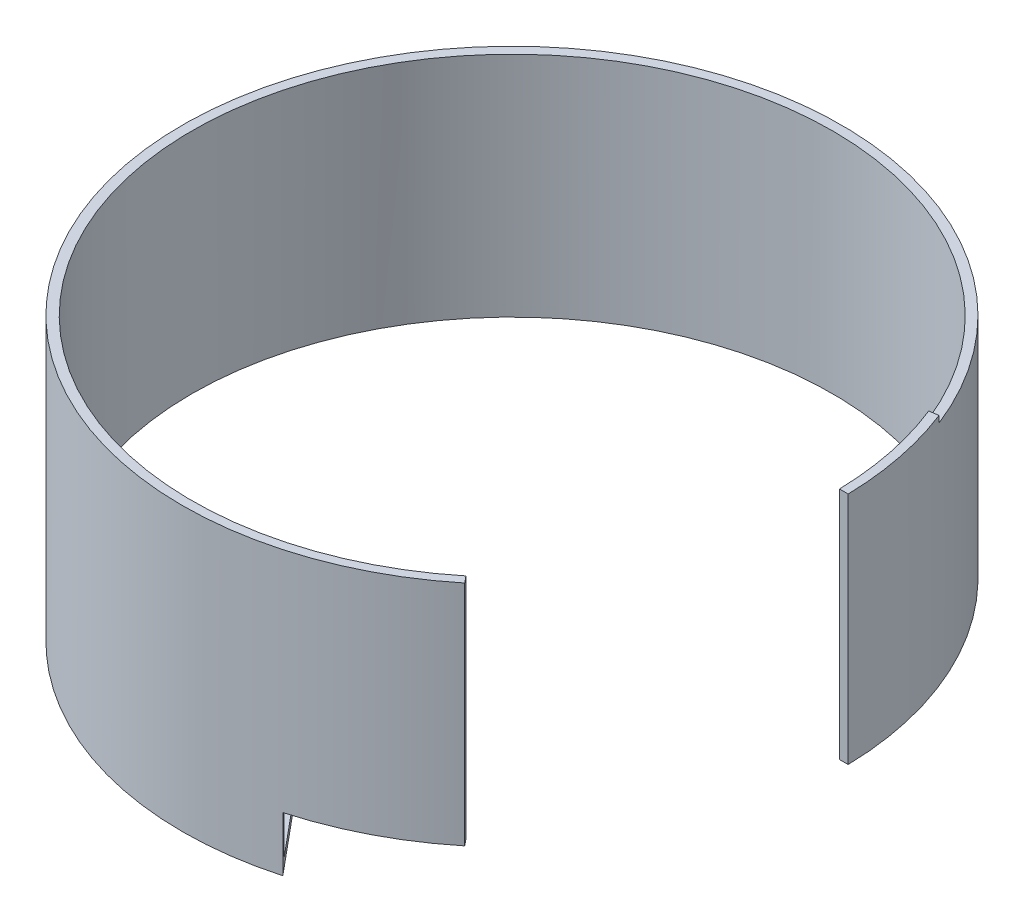
ISO-10303-21;
HEADER;
FILE_DESCRIPTION(('STEP AP214'),'2;1');
FILE_NAME('part.step','',(''),(''),'','','');
FILE_SCHEMA(('AUTOMOTIVE_DESIGN { 1 0 10303 214 1 1 1 1 }'));
ENDSEC;
DATA;
#1=APPLICATION_CONTEXT('core data for automotive mechanical design processes');
#2=APPLICATION_PROTOCOL_DEFINITION('international standard','automotive_design',2000,#1);
#3=PRODUCT_CONTEXT('',#1,'mechanical');
#4=PRODUCT('Part','Part','',(#3));
#5=PRODUCT_RELATED_PRODUCT_CATEGORY('part','',(#4));
#6=PRODUCT_DEFINITION_FORMATION('','',#4);
#7=PRODUCT_DEFINITION_CONTEXT('part definition',#1,'design');
#8=PRODUCT_DEFINITION('design','',#6,#7);
#9=PRODUCT_DEFINITION_SHAPE('','',#8);
#10=(LENGTH_UNIT() NAMED_UNIT(*) SI_UNIT(.MILLI.,.METRE.));
#11=(NAMED_UNIT(*) PLANE_ANGLE_UNIT() SI_UNIT($,.RADIAN.));
#12=(NAMED_UNIT(*) SI_UNIT($,.STERADIAN.) SOLID_ANGLE_UNIT());
#13=UNCERTAINTY_MEASURE_WITH_UNIT(LENGTH_MEASURE(1.E-05),#10,'distance_accuracy_value','');
#14=(GEOMETRIC_REPRESENTATION_CONTEXT(3) GLOBAL_UNCERTAINTY_ASSIGNED_CONTEXT((#13)) GLOBAL_UNIT_ASSIGNED_CONTEXT((#10,
#11,#12)) REPRESENTATION_CONTEXT('',''));
#15=CARTESIAN_POINT('',(0.,0.,0.));
#16=DIRECTION('',(0.,0.,1.));
#17=DIRECTION('',(1.,0.,0.));
#18=AXIS2_PLACEMENT_3D('',#15,#16,#17);
#19=CARTESIAN_POINT('',(0.,-98.298,0.));
#20=DIRECTION('',(0.,1.,0.));
#21=DIRECTION('',(0.,0.,1.));
#22=AXIS2_PLACEMENT_3D('',#19,#20,#21);
#23=CYLINDRICAL_SURFACE('',#22,116.674999949);
#24=DIRECTION('',(0.,-1.,0.));
#25=VECTOR('',#24,1.);
#26=CARTESIAN_POINT('',(29.7301940958419,-78.359,112.823628607321));
#27=LINE('',#26,#25);
#28=CARTESIAN_POINT('',(29.7301940958419,-78.359,112.823628607321));
#29=VERTEX_POINT('',#28);
#30=CARTESIAN_POINT('',(29.7301940958419,-95.123,112.823628607321));
#31=VERTEX_POINT('',#30);
#32=EDGE_CURVE('E297',#29,#31,#27,.T.);
#33=ORIENTED_EDGE('',*,*,#32,.T.);
#34=CARTESIAN_POINT('',(0.,-95.123,0.));
#35=DIRECTION('',(0.,-1.,0.));
#36=DIRECTION('',(0.,0.,-1.));
#37=AXIS2_PLACEMENT_3D('',#34,#35,#36);
#38=CIRCLE('',#37,116.674999949);
#39=CARTESIAN_POINT('',(-89.6891698800722,-95.123,74.6251192248475));
#40=VERTEX_POINT('',#39);
#41=EDGE_CURVE('E283',#31,#40,#38,.T.);
#42=ORIENTED_EDGE('',*,*,#41,.T.);
#43=DIRECTION('',(0.,-1.,0.));
#44=VECTOR('',#43,1.);
#45=CARTESIAN_POINT('',(-89.6891698800722,-78.359,74.6251192248475));
#46=LINE('',#45,#44);
#47=CARTESIAN_POINT('',(-89.6891698800722,-78.359,74.6251192248475));
#48=VERTEX_POINT('',#47);
#49=EDGE_CURVE('E313',#48,#40,#46,.T.);
#50=ORIENTED_EDGE('',*,*,#49,.F.);
#51=CARTESIAN_POINT('',(0.,-78.359,0.));
#52=DIRECTION('',(0.,-1.,0.));
#53=DIRECTION('',(0.,0.,-1.));
#54=AXIS2_PLACEMENT_3D('',#51,#52,#53);
#55=CIRCLE('',#54,116.674999949);
#56=CARTESIAN_POINT('',(116.647348933009,-78.359,-2.54));
#57=VERTEX_POINT('',#56);
#58=EDGE_CURVE('E175',#48,#57,#55,.T.);
#59=ORIENTED_EDGE('',*,*,#58,.T.);
#60=DIRECTION('',(0.,1.,0.));
#61=VECTOR('',#60,1.);
#62=CARTESIAN_POINT('',(116.647348933009,-98.298,-2.54));
#63=LINE('',#62,#61);
#64=CARTESIAN_POINT('',(116.647348933009,6.9835014,-2.53999999999999));
#65=VERTEX_POINT('',#64);
#66=EDGE_CURVE('E38',#57,#65,#63,.T.);
#67=ORIENTED_EDGE('',*,*,#66,.T.);
#68=CARTESIAN_POINT('',(2.78943534937071E-12,6.9835014,-5.62050406216485E-13));
#69=DIRECTION('',(0.,-1.,0.));
#70=DIRECTION('',(0.,0.,1.));
#71=AXIS2_PLACEMENT_3D('',#68,#69,#70);
#72=CIRCLE('',#71,116.674999948997);
#73=CARTESIAN_POINT('',(108.304935183754,6.9835014,-43.3946612838716));
#74=VERTEX_POINT('',#73);
#75=EDGE_CURVE('E173',#74,#65,#72,.T.);
#76=ORIENTED_EDGE('',*,*,#75,.F.);
#77=DIRECTION('',(0.,-1.,0.));
#78=VECTOR('',#77,1.);
#79=CARTESIAN_POINT('',(108.304935183754,6.9835014,-43.3946612838716));
#80=LINE('',#79,#78);
#81=CARTESIAN_POINT('',(108.304935183754,4.572,-43.3946612838716));
#82=VERTEX_POINT('',#81);
#83=EDGE_CURVE('E196',#74,#82,#80,.T.);
#84=ORIENTED_EDGE('',*,*,#83,.T.);
#85=CARTESIAN_POINT('',(0.,4.572,0.));
#86=DIRECTION('',(0.,1.,0.));
#87=DIRECTION('',(0.,0.,1.));
#88=AXIS2_PLACEMENT_3D('',#85,#86,#87);
#89=CIRCLE('',#88,116.674999949);
#90=CARTESIAN_POINT('',(73.6452892529888,4.572,90.4954528357241));
#91=VERTEX_POINT('',#90);
#92=EDGE_CURVE('E207',#82,#91,#89,.T.);
#93=ORIENTED_EDGE('',*,*,#92,.T.);
#94=DIRECTION('',(0.,1.,0.));
#95=VECTOR('',#94,1.);
#96=CARTESIAN_POINT('',(73.6452892529888,-98.298,90.4954528357241));
#97=LINE('',#96,#95);
#98=CARTESIAN_POINT('',(73.6452892529888,-78.359,90.4954528357241));
#99=VERTEX_POINT('',#98);
#100=EDGE_CURVE('E11',#99,#91,#97,.T.);
#101=ORIENTED_EDGE('',*,*,#100,.F.);
#102=CARTESIAN_POINT('',(2.0122792321331E-13,-78.359,3.33066907387547E-13));
#103=DIRECTION('',(0.,1.,0.));
#104=DIRECTION('',(0.,0.,1.));
#105=AXIS2_PLACEMENT_3D('',#102,#103,#104);
#106=CIRCLE('',#105,116.674999949);
#107=EDGE_CURVE('E323',#29,#99,#106,.T.);
#108=ORIENTED_EDGE('',*,*,#107,.F.);
#109=EDGE_LOOP('',(#33,#42,#50,#59,#67,#76,#84,#93,#101,#108));
#110=FACE_BOUND('',#109,.T.);
#111=ADVANCED_FACE('F35',(#110),#23,.F.);
#112=CARTESIAN_POINT('',(-0.184696627869449,-98.298,-0.08451396324239));
#113=DIRECTION('',(0.,1.,0.));
#114=DIRECTION('',(0.,0.,1.));
#115=AXIS2_PLACEMENT_3D('',#112,#113,#114);
#116=CYLINDRICAL_SURFACE('',#115,120.032164005851);
#117=CARTESIAN_POINT('',(-0.184696627869449,-78.359,-0.08451396324239));
#118=DIRECTION('',(0.,-1.,0.));
#119=DIRECTION('',(0.,0.,-1.));
#120=AXIS2_PLACEMENT_3D('',#117,#118,#119);
#121=CIRCLE('',#120,120.032164005851);
#122=CARTESIAN_POINT('',(-92.3373335218314,-78.359,76.8285012514602));
#123=VERTEX_POINT('',#122);
#124=CARTESIAN_POINT('',(119.822348933009,-78.359,-2.54000000000003));
#125=VERTEX_POINT('',#124);
#126=EDGE_CURVE('E305',#123,#125,#121,.T.);
#127=ORIENTED_EDGE('',*,*,#126,.F.);
#128=DIRECTION('',(0.,-1.,0.));
#129=VECTOR('',#128,1.);
#130=CARTESIAN_POINT('',(-92.3373335218314,-78.359,76.8285012514602));
#131=LINE('',#130,#129);
#132=CARTESIAN_POINT('',(-92.3373335218314,-98.298,76.8285012514602));
#133=VERTEX_POINT('',#132);
#134=EDGE_CURVE('E307',#123,#133,#131,.T.);
#135=ORIENTED_EDGE('',*,*,#134,.T.);
#136=CARTESIAN_POINT('',(-0.184696627869449,-98.298,-0.08451396324239));
#137=DIRECTION('',(0.,1.,0.));
#138=DIRECTION('',(0.,0.,1.));
#139=AXIS2_PLACEMENT_3D('',#136,#137,#138);
#140=CIRCLE('',#139,120.032164005851);
#141=CARTESIAN_POINT('',(32.0004356738825,-98.298,115.552148279518));
#142=VERTEX_POINT('',#141);
#143=EDGE_CURVE('E179',#133,#142,#140,.T.);
#144=ORIENTED_EDGE('',*,*,#143,.T.);
#145=DIRECTION('',(0.,-1.,0.));
#146=VECTOR('',#145,1.);
#147=CARTESIAN_POINT('',(32.0004356738826,-78.359,115.552148279518));
#148=LINE('',#147,#146);
#149=CARTESIAN_POINT('',(32.0004356738826,-78.359,115.552148279518));
#150=VERTEX_POINT('',#149);
#151=EDGE_CURVE('E59',#150,#142,#148,.T.);
#152=ORIENTED_EDGE('',*,*,#151,.F.);
#153=CARTESIAN_POINT('',(-0.184696627869425,-78.359,-0.0845139632423394));
#154=DIRECTION('',(0.,1.,0.));
#155=DIRECTION('',(0.,0.,1.));
#156=AXIS2_PLACEMENT_3D('',#153,#154,#155);
#157=CIRCLE('',#156,120.032164005851);
#158=CARTESIAN_POINT('',(75.6518916827654,-78.359,92.9559732954277));
#159=VERTEX_POINT('',#158);
#160=EDGE_CURVE('E320',#150,#159,#157,.T.);
#161=ORIENTED_EDGE('',*,*,#160,.T.);
#162=DIRECTION('',(0.,1.,0.));
#163=VECTOR('',#162,1.);
#164=CARTESIAN_POINT('',(75.6518916827654,-98.298,92.9559732954276));
#165=LINE('',#164,#163);
#166=CARTESIAN_POINT('',(75.6518916827654,4.572,92.9559732954276));
#167=VERTEX_POINT('',#166);
#168=EDGE_CURVE('E43',#159,#167,#165,.T.);
#169=ORIENTED_EDGE('',*,*,#168,.T.);
#170=CARTESIAN_POINT('',(-0.184696627869449,4.572,-0.08451396324239));
#171=DIRECTION('',(0.,1.,0.));
#172=DIRECTION('',(0.,0.,1.));
#173=AXIS2_PLACEMENT_3D('',#170,#171,#172);
#174=CIRCLE('',#173,120.032164005851);
#175=CARTESIAN_POINT('',(111.569940957261,4.572,-43.8865843953988));
#176=VERTEX_POINT('',#175);
#177=EDGE_CURVE('E202',#176,#167,#174,.T.);
#178=ORIENTED_EDGE('',*,*,#177,.F.);
#179=DIRECTION('',(0.,-1.,0.));
#180=VECTOR('',#179,1.);
#181=CARTESIAN_POINT('',(111.569940957261,6.9835014,-43.8865843953988));
#182=LINE('',#181,#180);
#183=CARTESIAN_POINT('',(111.569940957261,6.9835014,-43.8865843953988));
#184=VERTEX_POINT('',#183);
#185=EDGE_CURVE('E199',#184,#176,#182,.T.);
#186=ORIENTED_EDGE('',*,*,#185,.F.);
#187=CARTESIAN_POINT('',(-0.1846966278745,6.9835014,-0.0845139632413942));
#188=DIRECTION('',(0.,1.,0.));
#189=DIRECTION('',(0.,0.,1.));
#190=AXIS2_PLACEMENT_3D('',#187,#188,#189);
#191=CIRCLE('',#190,120.032164005856);
#192=CARTESIAN_POINT('',(119.822348933009,6.9835014,-2.53999999999999));
#193=VERTEX_POINT('',#192);
#194=EDGE_CURVE('E186',#193,#184,#191,.T.);
#195=ORIENTED_EDGE('',*,*,#194,.F.);
#196=DIRECTION('',(0.,1.,0.));
#197=VECTOR('',#196,1.);
#198=CARTESIAN_POINT('',(119.822348933009,-98.298,-2.54));
#199=LINE('',#198,#197);
#200=EDGE_CURVE('E178',#125,#193,#199,.T.);
#201=ORIENTED_EDGE('',*,*,#200,.F.);
#202=EDGE_LOOP('',(#127,#135,#144,#152,#161,#169,#178,#186,#195,#201));
#203=FACE_BOUND('',#202,.T.);
#204=ADVANCED_FACE('F336',(#203),#116,.T.);
#205=CARTESIAN_POINT('',(116.647348933009,-98.298,-2.54));
#206=DIRECTION('',(0.,0.,1.));
#207=DIRECTION('',(1.,0.,0.));
#208=AXIS2_PLACEMENT_3D('',#205,#206,#207);
#209=PLANE('',#208);
#210=ORIENTED_EDGE('',*,*,#66,.F.);
#211=DIRECTION('',(1.,0.,0.));
#212=VECTOR('',#211,1.);
#213=CARTESIAN_POINT('',(116.647348933009,-78.359,-2.54));
#214=LINE('',#213,#212);
#215=EDGE_CURVE('E303',#57,#125,#214,.T.);
#216=ORIENTED_EDGE('',*,*,#215,.T.);
#217=ORIENTED_EDGE('',*,*,#200,.T.);
#218=DIRECTION('',(1.,0.,0.));
#219=VECTOR('',#218,1.);
#220=CARTESIAN_POINT('',(116.647348933009,6.9835014,-2.53999999999999));
#221=LINE('',#220,#219);
#222=EDGE_CURVE('E181',#65,#193,#221,.T.);
#223=ORIENTED_EDGE('',*,*,#222,.F.);
#224=EDGE_LOOP('',(#210,#216,#217,#223));
#225=FACE_BOUND('',#224,.T.);
#226=ADVANCED_FACE('F182',(#225),#209,.T.);
#227=CARTESIAN_POINT('',(0.,-98.298,0.));
#228=DIRECTION('',(0.,1.,0.));
#229=DIRECTION('',(0.,0.,1.));
#230=AXIS2_PLACEMENT_3D('',#227,#228,#229);
#231=PLANE('',#230);
#232=DIRECTION('',(0.768709441738251,0.,-0.639598150546471));
#233=VECTOR('',#232,1.);
#234=CARTESIAN_POINT('',(-92.3373335218314,-98.298,76.8285012514601));
#235=LINE('',#234,#233);
#236=CARTESIAN_POINT('',(-37.9034466150368,-98.298,31.5372487934262));
#237=VERTEX_POINT('',#236);
#238=EDGE_CURVE('E301',#133,#237,#235,.T.);
#239=ORIENTED_EDGE('',*,*,#238,.T.);
#240=DIRECTION('',(-0.63959815054647,0.,-0.768709441738252));
#241=VECTOR('',#240,1.);
#242=CARTESIAN_POINT('',(32.0004356738826,-98.298,115.552148279518));
#243=LINE('',#242,#241);
#244=EDGE_CURVE('E310',#142,#237,#243,.T.);
#245=ORIENTED_EDGE('',*,*,#244,.F.);
#246=ORIENTED_EDGE('',*,*,#143,.F.);
#247=EDGE_LOOP('',(#239,#245,#246));
#248=FACE_BOUND('',#247,.T.);
#249=CARTESIAN_POINT('',(-66.1804562405467,-98.298,73.4133647851566));
#250=DIRECTION('',(0.,-1.,0.));
#251=DIRECTION('',(0.,0.,-1.));
#252=AXIS2_PLACEMENT_3D('',#249,#250,#251);
#253=CIRCLE('',#252,6.35);
#254=CARTESIAN_POINT('',(-71.0243507529685,-98.298,77.5193586907208));
#255=VERTEX_POINT('',#254);
#256=CARTESIAN_POINT('',(-61.3365617281249,-98.298,69.3073708795925));
#257=VERTEX_POINT('',#256);
#258=EDGE_CURVE('E209',#255,#257,#253,.T.);
#259=ORIENTED_EDGE('',*,*,#258,.F.);
#260=DIRECTION('',(-0.646613213474671,0.,-0.762818033452251));
#261=VECTOR('',#260,1.);
#262=CARTESIAN_POINT('',(-71.0243507529685,-98.298,77.5193586907208));
#263=LINE('',#262,#261);
#264=CARTESIAN_POINT('',(-51.2035880884852,-98.298,100.902170675025));
#265=VERTEX_POINT('',#264);
#266=EDGE_CURVE('E214',#265,#255,#263,.T.);
#267=ORIENTED_EDGE('',*,*,#266,.F.);
#268=CARTESIAN_POINT('',(-46.3596935760634,-98.298,96.7961767694608));
#269=DIRECTION('',(0.,-1.,0.));
#270=DIRECTION('',(0.,0.,1.));
#271=AXIS2_PLACEMENT_3D('',#268,#269,#270);
#272=CIRCLE('',#271,6.35);
#273=CARTESIAN_POINT('',(-41.5157990636416,-98.298,92.6901828638966));
#274=VERTEX_POINT('',#273);
#275=EDGE_CURVE('E228',#274,#265,#272,.T.);
#276=ORIENTED_EDGE('',*,*,#275,.F.);
#277=DIRECTION('',(0.646613213474671,0.,0.762818033452251));
#278=VECTOR('',#277,1.);
#279=CARTESIAN_POINT('',(-61.3365617281249,-98.298,69.3073708795925));
#280=LINE('',#279,#278);
#281=EDGE_CURVE('E225',#257,#274,#280,.T.);
#282=ORIENTED_EDGE('',*,*,#281,.F.);
#283=EDGE_LOOP('',(#259,#267,#276,#282));
#284=FACE_BOUND('',#283,.T.);
#285=CARTESIAN_POINT('',(-49.0690072513944,-98.298,56.93984279488));
#286=DIRECTION('',(0.,-1.,0.));
#287=DIRECTION('',(0.,0.,-1.));
#288=AXIS2_PLACEMENT_3D('',#285,#286,#287);
#289=CIRCLE('',#288,6.35000000000001);
#290=CARTESIAN_POINT('',(-53.9503122064323,-98.298,61.0012910508501));
#291=VERTEX_POINT('',#290);
#292=CARTESIAN_POINT('',(-44.1877022963565,-98.298,52.8783945389099));
#293=VERTEX_POINT('',#292);
#294=EDGE_CURVE('E235',#291,#293,#289,.T.);
#295=ORIENTED_EDGE('',*,*,#294,.F.);
#296=DIRECTION('',(-0.639598150546469,0.,-0.768709441738253));
#297=VECTOR('',#296,1.);
#298=CARTESIAN_POINT('',(-53.9503122064323,-98.298,61.0012910508501));
#299=LINE('',#298,#297);
#300=CARTESIAN_POINT('',(-21.5511486370197,-98.298,99.9406515210927));
#301=VERTEX_POINT('',#300);
#302=EDGE_CURVE('E246',#301,#291,#299,.T.);
#303=ORIENTED_EDGE('',*,*,#302,.F.);
#304=CARTESIAN_POINT('',(-16.6698436819818,-98.298,95.8792032651226));
#305=DIRECTION('',(0.,-1.,0.));
#306=DIRECTION('',(0.,0.,1.));
#307=AXIS2_PLACEMENT_3D('',#304,#305,#306);
#308=CIRCLE('',#307,6.35000000000001);
#309=CARTESIAN_POINT('',(-11.7885387269439,-98.298,91.8177550091525));
#310=VERTEX_POINT('',#309);
#311=EDGE_CURVE('E260',#310,#301,#308,.T.);
#312=ORIENTED_EDGE('',*,*,#311,.F.);
#313=DIRECTION('',(0.639598150546469,0.,0.768709441738253));
#314=VECTOR('',#313,1.);
#315=CARTESIAN_POINT('',(-44.1877022963565,-98.298,52.8783945389099));
#316=LINE('',#315,#314);
#317=EDGE_CURVE('E257',#293,#310,#316,.T.);
#318=ORIENTED_EDGE('',*,*,#317,.F.);
#319=EDGE_LOOP('',(#295,#303,#312,#318));
#320=FACE_BOUND('',#319,.T.);
#321=CARTESIAN_POINT('',(10.393383929728,-98.298,103.482781479031));
#322=DIRECTION('',(0.,-1.,0.));
#323=DIRECTION('',(0.,0.,-1.));
#324=AXIS2_PLACEMENT_3D('',#321,#322,#323);
#325=CIRCLE('',#324,3.50000000000001);
#326=CARTESIAN_POINT('',(10.393383929728,-98.298,99.9827814790306));
#327=VERTEX_POINT('',#326);
#328=EDGE_CURVE('E267',#327,#327,#325,.T.);
#329=ORIENTED_EDGE('',*,*,#328,.F.);
#330=EDGE_LOOP('',(#329));
#331=FACE_BOUND('',#330,.T.);
#332=CARTESIAN_POINT('',(-10.6211082019412,-98.298,78.2262379741027));
#333=DIRECTION('',(0.,-1.,0.));
#334=DIRECTION('',(0.,0.,-1.));
#335=AXIS2_PLACEMENT_3D('',#332,#333,#334);
#336=CIRCLE('',#335,3.50000000000001);
#337=CARTESIAN_POINT('',(-10.6211082019412,-98.298,74.7262379741027));
#338=VERTEX_POINT('',#337);
#339=EDGE_CURVE('E277',#338,#338,#336,.T.);
#340=ORIENTED_EDGE('',*,*,#339,.F.);
#341=EDGE_LOOP('',(#340));
#342=FACE_BOUND('',#341,.T.);
#343=ADVANCED_FACE('F357',(#248,#284,#320,#331,#342),#231,.F.);
#344=CARTESIAN_POINT('',(73.6452892529888,-98.298,90.4954528357241));
#345=DIRECTION('',(0.774967487374088,0.,-0.632001102461928));
#346=DIRECTION('',(-0.632001102461928,0.,-0.774967487374088));
#347=AXIS2_PLACEMENT_3D('',#344,#345,#346);
#348=PLANE('',#347);
#349=DIRECTION('',(0.632001102461916,0.,0.774967487374098));
#350=VECTOR('',#349,1.);
#351=CARTESIAN_POINT('',(73.6452892529888,-78.359,90.4954528357241));
#352=LINE('',#351,#350);
#353=EDGE_CURVE('E325',#99,#159,#352,.T.);
#354=ORIENTED_EDGE('',*,*,#353,.F.);
#355=ORIENTED_EDGE('',*,*,#100,.T.);
#356=DIRECTION('',(-0.632001102461935,0.,-0.774967487374082));
#357=VECTOR('',#356,1.);
#358=CARTESIAN_POINT('',(75.6518916827654,4.572,92.9559732954276));
#359=LINE('',#358,#357);
#360=EDGE_CURVE('E204',#167,#91,#359,.T.);
#361=ORIENTED_EDGE('',*,*,#360,.F.);
#362=ORIENTED_EDGE('',*,*,#168,.F.);
#363=EDGE_LOOP('',(#354,#355,#361,#362));
#364=FACE_BOUND('',#363,.T.);
#365=ADVANCED_FACE('F340',(#364),#348,.T.);
#366=CARTESIAN_POINT('',(32.0004356738826,-78.359,115.552148279518));
#367=DIRECTION('',(-0.768709441738252,0.,0.63959815054647));
#368=DIRECTION('',(0.63959815054647,0.,0.768709441738252));
#369=AXIS2_PLACEMENT_3D('',#366,#367,#368);
#370=PLANE('',#369);
#371=ORIENTED_EDGE('',*,*,#244,.T.);
#372=DIRECTION('',(0.,-1.,0.));
#373=VECTOR('',#372,1.);
#374=CARTESIAN_POINT('',(-37.9034466150368,-95.123,31.5372487934262));
#375=LINE('',#374,#373);
#376=CARTESIAN_POINT('',(-37.9034466150368,-95.123,31.5372487934262));
#377=VERTEX_POINT('',#376);
#378=EDGE_CURVE('E294',#377,#237,#375,.T.);
#379=ORIENTED_EDGE('',*,*,#378,.F.);
#380=DIRECTION('',(0.639598150546469,0.,0.768709441738252));
#381=VECTOR('',#380,1.);
#382=CARTESIAN_POINT('',(-37.9034466150368,-95.123,31.5372487934262));
#383=LINE('',#382,#381);
#384=EDGE_CURVE('E291',#377,#31,#383,.T.);
#385=ORIENTED_EDGE('',*,*,#384,.T.);
#386=ORIENTED_EDGE('',*,*,#32,.F.);
#387=DIRECTION('',(-0.63959815054647,0.,-0.768709441738252));
#388=VECTOR('',#387,1.);
#389=CARTESIAN_POINT('',(32.0004356738826,-78.359,115.552148279518));
#390=LINE('',#389,#388);
#391=EDGE_CURVE('E318',#150,#29,#390,.T.);
#392=ORIENTED_EDGE('',*,*,#391,.F.);
#393=ORIENTED_EDGE('',*,*,#151,.T.);
#394=EDGE_LOOP('',(#371,#379,#385,#386,#392,#393));
#395=FACE_BOUND('',#394,.T.);
#396=ADVANCED_FACE('F355',(#395),#370,.F.);
#397=CARTESIAN_POINT('',(-0.184696627869425,-78.359,-0.0845139632423394));
#398=DIRECTION('',(0.,1.,0.));
#399=DIRECTION('',(0.,0.,1.));
#400=AXIS2_PLACEMENT_3D('',#397,#398,#399);
#401=PLANE('',#400);
#402=ORIENTED_EDGE('',*,*,#160,.F.);
#403=ORIENTED_EDGE('',*,*,#391,.T.);
#404=ORIENTED_EDGE('',*,*,#107,.T.);
#405=ORIENTED_EDGE('',*,*,#353,.T.);
#406=EDGE_LOOP('',(#402,#403,#404,#405));
#407=FACE_BOUND('',#406,.T.);
#408=ADVANCED_FACE('F399',(#407),#401,.F.);
#409=CARTESIAN_POINT('',(-92.3373335218314,-78.359,76.8285012514601));
#410=DIRECTION('',(-0.639598150546471,0.,-0.768709441738251));
#411=DIRECTION('',(-0.768709441738251,0.,0.639598150546471));
#412=AXIS2_PLACEMENT_3D('',#409,#410,#411);
#413=PLANE('',#412);
#414=ORIENTED_EDGE('',*,*,#238,.F.);
#415=ORIENTED_EDGE('',*,*,#134,.F.);
#416=DIRECTION('',(0.768709441738251,0.,-0.639598150546471));
#417=VECTOR('',#416,1.);
#418=CARTESIAN_POINT('',(-92.3373335218314,-78.359,76.8285012514601));
#419=LINE('',#418,#417);
#420=EDGE_CURVE('E298',#123,#48,#419,.T.);
#421=ORIENTED_EDGE('',*,*,#420,.T.);
#422=ORIENTED_EDGE('',*,*,#49,.T.);
#423=DIRECTION('',(0.768709441738252,0.,-0.63959815054647));
#424=VECTOR('',#423,1.);
#425=CARTESIAN_POINT('',(-89.6891698800722,-95.123,74.6251192248475));
#426=LINE('',#425,#424);
#427=EDGE_CURVE('E288',#40,#377,#426,.T.);
#428=ORIENTED_EDGE('',*,*,#427,.T.);
#429=ORIENTED_EDGE('',*,*,#378,.T.);
#430=EDGE_LOOP('',(#414,#415,#421,#422,#428,#429));
#431=FACE_BOUND('',#430,.T.);
#432=ADVANCED_FACE('F350',(#431),#413,.T.);
#433=CARTESIAN_POINT('',(0.,-78.359,0.));
#434=DIRECTION('',(0.,-1.,0.));
#435=DIRECTION('',(0.,0.,-1.));
#436=AXIS2_PLACEMENT_3D('',#433,#434,#435);
#437=PLANE('',#436);
#438=ORIENTED_EDGE('',*,*,#420,.F.);
#439=ORIENTED_EDGE('',*,*,#126,.T.);
#440=ORIENTED_EDGE('',*,*,#215,.F.);
#441=ORIENTED_EDGE('',*,*,#58,.F.);
#442=EDGE_LOOP('',(#438,#439,#440,#441));
#443=FACE_BOUND('',#442,.T.);
#444=ADVANCED_FACE('F348',(#443),#437,.T.);
#445=CARTESIAN_POINT('',(0.,-95.123,0.));
#446=DIRECTION('',(0.,-1.,0.));
#447=DIRECTION('',(0.,0.,-1.));
#448=AXIS2_PLACEMENT_3D('',#445,#446,#447);
#449=PLANE('',#448);
#450=DIRECTION('',(-0.646613213474671,0.,-0.762818033452251));
#451=VECTOR('',#450,1.);
#452=CARTESIAN_POINT('',(-71.0243507529685,-95.123,77.5193586907208));
#453=LINE('',#452,#451);
#454=CARTESIAN_POINT('',(-51.2035880884852,-95.123,100.902170675025));
#455=VERTEX_POINT('',#454);
#456=CARTESIAN_POINT('',(-71.0243507529685,-95.123,77.5193586907208));
#457=VERTEX_POINT('',#456);
#458=EDGE_CURVE('E220',#455,#457,#453,.T.);
#459=ORIENTED_EDGE('',*,*,#458,.T.);
#460=CARTESIAN_POINT('',(-66.1804562405467,-95.123,73.4133647851566));
#461=DIRECTION('',(0.,-1.,0.));
#462=DIRECTION('',(0.,0.,-1.));
#463=AXIS2_PLACEMENT_3D('',#460,#461,#462);
#464=CIRCLE('',#463,6.35);
#465=CARTESIAN_POINT('',(-61.3365617281249,-95.123,69.3073708795925));
#466=VERTEX_POINT('',#465);
#467=EDGE_CURVE('E210',#457,#466,#464,.T.);
#468=ORIENTED_EDGE('',*,*,#467,.T.);
#469=DIRECTION('',(0.646613213474671,0.,0.762818033452251));
#470=VECTOR('',#469,1.);
#471=CARTESIAN_POINT('',(-61.3365617281249,-95.123,69.3073708795925));
#472=LINE('',#471,#470);
#473=CARTESIAN_POINT('',(-41.5157990636416,-95.123,92.6901828638966));
#474=VERTEX_POINT('',#473);
#475=EDGE_CURVE('E213',#466,#474,#472,.T.);
#476=ORIENTED_EDGE('',*,*,#475,.T.);
#477=CARTESIAN_POINT('',(-46.3596935760634,-95.123,96.7961767694608));
#478=DIRECTION('',(0.,-1.,0.));
#479=DIRECTION('',(0.,0.,1.));
#480=AXIS2_PLACEMENT_3D('',#477,#478,#479);
#481=CIRCLE('',#480,6.35);
#482=EDGE_CURVE('E217',#474,#455,#481,.T.);
#483=ORIENTED_EDGE('',*,*,#482,.T.);
#484=EDGE_LOOP('',(#459,#468,#476,#483));
#485=FACE_BOUND('',#484,.T.);
#486=DIRECTION('',(-0.639598150546469,0.,-0.768709441738253));
#487=VECTOR('',#486,1.);
#488=CARTESIAN_POINT('',(-53.9503122064323,-95.123,61.0012910508501));
#489=LINE('',#488,#487);
#490=CARTESIAN_POINT('',(-21.5511486370197,-95.123,99.9406515210927));
#491=VERTEX_POINT('',#490);
#492=CARTESIAN_POINT('',(-53.9503122064323,-95.123,61.0012910508501));
#493=VERTEX_POINT('',#492);
#494=EDGE_CURVE('E252',#491,#493,#489,.T.);
#495=ORIENTED_EDGE('',*,*,#494,.T.);
#496=CARTESIAN_POINT('',(-49.0690072513944,-95.123,56.93984279488));
#497=DIRECTION('',(0.,-1.,0.));
#498=DIRECTION('',(0.,0.,-1.));
#499=AXIS2_PLACEMENT_3D('',#496,#497,#498);
#500=CIRCLE('',#499,6.35000000000001);
#501=CARTESIAN_POINT('',(-44.1877022963565,-95.123,52.8783945389099));
#502=VERTEX_POINT('',#501);
#503=EDGE_CURVE('E242',#493,#502,#500,.T.);
#504=ORIENTED_EDGE('',*,*,#503,.T.);
#505=DIRECTION('',(0.639598150546469,0.,0.768709441738253));
#506=VECTOR('',#505,1.);
#507=CARTESIAN_POINT('',(-44.1877022963565,-95.123,52.8783945389099));
#508=LINE('',#507,#506);
#509=CARTESIAN_POINT('',(-11.7885387269439,-95.123,91.8177550091525));
#510=VERTEX_POINT('',#509);
#511=EDGE_CURVE('E245',#502,#510,#508,.T.);
#512=ORIENTED_EDGE('',*,*,#511,.T.);
#513=CARTESIAN_POINT('',(-16.6698436819818,-95.123,95.8792032651226));
#514=DIRECTION('',(0.,-1.,0.));
#515=DIRECTION('',(0.,0.,1.));
#516=AXIS2_PLACEMENT_3D('',#513,#514,#515);
#517=CIRCLE('',#516,6.35000000000001);
#518=EDGE_CURVE('E249',#510,#491,#517,.T.);
#519=ORIENTED_EDGE('',*,*,#518,.T.);
#520=EDGE_LOOP('',(#495,#504,#512,#519));
#521=FACE_BOUND('',#520,.T.);
#522=CARTESIAN_POINT('',(10.393383929728,-95.123,103.482781479031));
#523=DIRECTION('',(0.,-1.,0.));
#524=DIRECTION('',(0.,0.,-1.));
#525=AXIS2_PLACEMENT_3D('',#522,#523,#524);
#526=CIRCLE('',#525,3.50000000000001);
#527=CARTESIAN_POINT('',(10.393383929728,-95.123,99.9827814790306));
#528=VERTEX_POINT('',#527);
#529=EDGE_CURVE('E274',#528,#528,#526,.T.);
#530=ORIENTED_EDGE('',*,*,#529,.T.);
#531=EDGE_LOOP('',(#530));
#532=FACE_BOUND('',#531,.T.);
#533=CARTESIAN_POINT('',(-10.6211082019412,-95.123,78.2262379741027));
#534=DIRECTION('',(0.,-1.,0.));
#535=DIRECTION('',(0.,0.,-1.));
#536=AXIS2_PLACEMENT_3D('',#533,#534,#535);
#537=CIRCLE('',#536,3.50000000000001);
#538=CARTESIAN_POINT('',(-10.6211082019412,-95.123,74.7262379741027));
#539=VERTEX_POINT('',#538);
#540=EDGE_CURVE('E280',#539,#539,#537,.T.);
#541=ORIENTED_EDGE('',*,*,#540,.T.);
#542=EDGE_LOOP('',(#541));
#543=FACE_BOUND('',#542,.T.);
#544=ORIENTED_EDGE('',*,*,#41,.F.);
#545=ORIENTED_EDGE('',*,*,#384,.F.);
#546=ORIENTED_EDGE('',*,*,#427,.F.);
#547=EDGE_LOOP('',(#544,#545,#546));
#548=FACE_BOUND('',#547,.T.);
#549=ADVANCED_FACE('F354',(#485,#521,#532,#543,#548),#449,.F.);
#550=CARTESIAN_POINT('',(-10.6211082019412,-95.123,78.2262379741027));
#551=DIRECTION('',(0.,-1.,0.));
#552=DIRECTION('',(0.,0.,-1.));
#553=AXIS2_PLACEMENT_3D('',#550,#551,#552);
#554=CYLINDRICAL_SURFACE('',#553,3.50000000000001);
#555=ORIENTED_EDGE('',*,*,#540,.F.);
#556=EDGE_LOOP('',(#555));
#557=FACE_BOUND('',#556,.T.);
#558=ORIENTED_EDGE('',*,*,#339,.T.);
#559=EDGE_LOOP('',(#558));
#560=FACE_BOUND('',#559,.T.);
#561=ADVANCED_FACE('F373',(#557,#560),#554,.F.);
#562=CARTESIAN_POINT('',(10.393383929728,-95.123,103.482781479031));
#563=DIRECTION('',(0.,-1.,0.));
#564=DIRECTION('',(0.,0.,-1.));
#565=AXIS2_PLACEMENT_3D('',#562,#563,#564);
#566=CYLINDRICAL_SURFACE('',#565,3.50000000000001);
#567=ORIENTED_EDGE('',*,*,#529,.F.);
#568=EDGE_LOOP('',(#567));
#569=FACE_BOUND('',#568,.T.);
#570=ORIENTED_EDGE('',*,*,#328,.T.);
#571=EDGE_LOOP('',(#570));
#572=FACE_BOUND('',#571,.T.);
#573=ADVANCED_FACE('F375',(#569,#572),#566,.F.);
#574=CARTESIAN_POINT('',(-49.0690072513944,-95.123,56.93984279488));
#575=DIRECTION('',(0.,-1.,0.));
#576=DIRECTION('',(0.,0.,-1.));
#577=AXIS2_PLACEMENT_3D('',#574,#575,#576);
#578=CYLINDRICAL_SURFACE('',#577,6.35000000000001);
#579=ORIENTED_EDGE('',*,*,#294,.T.);
#580=DIRECTION('',(0.,-1.,0.));
#581=VECTOR('',#580,1.);
#582=CARTESIAN_POINT('',(-44.1877022963565,-95.123,52.8783945389099));
#583=LINE('',#582,#581);
#584=EDGE_CURVE('E255',#502,#293,#583,.T.);
#585=ORIENTED_EDGE('',*,*,#584,.F.);
#586=ORIENTED_EDGE('',*,*,#503,.F.);
#587=DIRECTION('',(0.,-1.,0.));
#588=VECTOR('',#587,1.);
#589=CARTESIAN_POINT('',(-53.9503122064323,-95.123,61.0012910508501));
#590=LINE('',#589,#588);
#591=EDGE_CURVE('E265',#493,#291,#590,.T.);
#592=ORIENTED_EDGE('',*,*,#591,.T.);
#593=EDGE_LOOP('',(#579,#585,#586,#592));
#594=FACE_BOUND('',#593,.T.);
#595=ADVANCED_FACE('F382',(#594),#578,.F.);
#596=CARTESIAN_POINT('',(-53.9503122064323,-95.123,61.0012910508501));
#597=DIRECTION('',(-0.768709441738253,0.,0.639598150546469));
#598=DIRECTION('',(0.639598150546469,0.,0.768709441738253));
#599=AXIS2_PLACEMENT_3D('',#596,#597,#598);
#600=PLANE('',#599);
#601=ORIENTED_EDGE('',*,*,#302,.T.);
#602=ORIENTED_EDGE('',*,*,#591,.F.);
#603=ORIENTED_EDGE('',*,*,#494,.F.);
#604=DIRECTION('',(0.,-1.,0.));
#605=VECTOR('',#604,1.);
#606=CARTESIAN_POINT('',(-21.5511486370197,-95.123,99.9406515210927));
#607=LINE('',#606,#605);
#608=EDGE_CURVE('E268',#491,#301,#607,.T.);
#609=ORIENTED_EDGE('',*,*,#608,.T.);
#610=EDGE_LOOP('',(#601,#602,#603,#609));
#611=FACE_BOUND('',#610,.T.);
#612=ADVANCED_FACE('F440',(#611),#600,.F.);
#613=CARTESIAN_POINT('',(-16.6698436819818,-95.123,95.8792032651226));
#614=DIRECTION('',(0.,-1.,0.));
#615=DIRECTION('',(0.,0.,-1.));
#616=AXIS2_PLACEMENT_3D('',#613,#614,#615);
#617=CYLINDRICAL_SURFACE('',#616,6.35000000000001);
#618=ORIENTED_EDGE('',*,*,#311,.T.);
#619=ORIENTED_EDGE('',*,*,#608,.F.);
#620=ORIENTED_EDGE('',*,*,#518,.F.);
#621=DIRECTION('',(0.,-1.,0.));
#622=VECTOR('',#621,1.);
#623=CARTESIAN_POINT('',(-11.7885387269439,-95.123,91.8177550091525));
#624=LINE('',#623,#622);
#625=EDGE_CURVE('E270',#510,#310,#624,.T.);
#626=ORIENTED_EDGE('',*,*,#625,.T.);
#627=EDGE_LOOP('',(#618,#619,#620,#626));
#628=FACE_BOUND('',#627,.T.);
#629=ADVANCED_FACE('F450',(#628),#617,.F.);
#630=CARTESIAN_POINT('',(-44.1877022963565,-95.123,52.8783945389099));
#631=DIRECTION('',(0.768709441738253,0.,-0.639598150546469));
#632=DIRECTION('',(-0.639598150546469,0.,-0.768709441738253));
#633=AXIS2_PLACEMENT_3D('',#630,#631,#632);
#634=PLANE('',#633);
#635=ORIENTED_EDGE('',*,*,#317,.T.);
#636=ORIENTED_EDGE('',*,*,#625,.F.);
#637=ORIENTED_EDGE('',*,*,#511,.F.);
#638=ORIENTED_EDGE('',*,*,#584,.T.);
#639=EDGE_LOOP('',(#635,#636,#637,#638));
#640=FACE_BOUND('',#639,.T.);
#641=ADVANCED_FACE('F460',(#640),#634,.F.);
#642=CARTESIAN_POINT('',(-66.1804562405467,-95.123,73.4133647851566));
#643=DIRECTION('',(0.,-1.,0.));
#644=DIRECTION('',(0.,0.,-1.));
#645=AXIS2_PLACEMENT_3D('',#642,#643,#644);
#646=CYLINDRICAL_SURFACE('',#645,6.35);
#647=ORIENTED_EDGE('',*,*,#258,.T.);
#648=DIRECTION('',(0.,-1.,0.));
#649=VECTOR('',#648,1.);
#650=CARTESIAN_POINT('',(-61.3365617281249,-95.123,69.3073708795925));
#651=LINE('',#650,#649);
#652=EDGE_CURVE('E223',#466,#257,#651,.T.);
#653=ORIENTED_EDGE('',*,*,#652,.F.);
#654=ORIENTED_EDGE('',*,*,#467,.F.);
#655=DIRECTION('',(0.,-1.,0.));
#656=VECTOR('',#655,1.);
#657=CARTESIAN_POINT('',(-71.0243507529685,-95.123,77.5193586907208));
#658=LINE('',#657,#656);
#659=EDGE_CURVE('E233',#457,#255,#658,.T.);
#660=ORIENTED_EDGE('',*,*,#659,.T.);
#661=EDGE_LOOP('',(#647,#653,#654,#660));
#662=FACE_BOUND('',#661,.T.);
#663=ADVANCED_FACE('F470',(#662),#646,.F.);
#664=CARTESIAN_POINT('',(-71.0243507529685,-95.123,77.5193586907208));
#665=DIRECTION('',(-0.762818033452251,0.,0.646613213474671));
#666=DIRECTION('',(0.646613213474671,0.,0.762818033452251));
#667=AXIS2_PLACEMENT_3D('',#664,#665,#666);
#668=PLANE('',#667);
#669=ORIENTED_EDGE('',*,*,#266,.T.);
#670=ORIENTED_EDGE('',*,*,#659,.F.);
#671=ORIENTED_EDGE('',*,*,#458,.F.);
#672=DIRECTION('',(0.,-1.,0.));
#673=VECTOR('',#672,1.);
#674=CARTESIAN_POINT('',(-51.2035880884852,-95.123,100.902170675025));
#675=LINE('',#674,#673);
#676=EDGE_CURVE('E236',#455,#265,#675,.T.);
#677=ORIENTED_EDGE('',*,*,#676,.T.);
#678=EDGE_LOOP('',(#669,#670,#671,#677));
#679=FACE_BOUND('',#678,.T.);
#680=ADVANCED_FACE('F480',(#679),#668,.F.);
#681=CARTESIAN_POINT('',(-46.3596935760634,-95.123,96.7961767694608));
#682=DIRECTION('',(0.,-1.,0.));
#683=DIRECTION('',(0.,0.,-1.));
#684=AXIS2_PLACEMENT_3D('',#681,#682,#683);
#685=CYLINDRICAL_SURFACE('',#684,6.35);
#686=ORIENTED_EDGE('',*,*,#275,.T.);
#687=ORIENTED_EDGE('',*,*,#676,.F.);
#688=ORIENTED_EDGE('',*,*,#482,.F.);
#689=DIRECTION('',(0.,-1.,0.));
#690=VECTOR('',#689,1.);
#691=CARTESIAN_POINT('',(-41.5157990636416,-95.123,92.6901828638966));
#692=LINE('',#691,#690);
#693=EDGE_CURVE('E238',#474,#274,#692,.T.);
#694=ORIENTED_EDGE('',*,*,#693,.T.);
#695=EDGE_LOOP('',(#686,#687,#688,#694));
#696=FACE_BOUND('',#695,.T.);
#697=ADVANCED_FACE('F490',(#696),#685,.F.);
#698=CARTESIAN_POINT('',(-61.3365617281249,-95.123,69.3073708795925));
#699=DIRECTION('',(0.762818033452251,0.,-0.646613213474671));
#700=DIRECTION('',(-0.646613213474671,0.,-0.762818033452251));
#701=AXIS2_PLACEMENT_3D('',#698,#699,#700);
#702=PLANE('',#701);
#703=ORIENTED_EDGE('',*,*,#281,.T.);
#704=ORIENTED_EDGE('',*,*,#693,.F.);
#705=ORIENTED_EDGE('',*,*,#475,.F.);
#706=ORIENTED_EDGE('',*,*,#652,.T.);
#707=EDGE_LOOP('',(#703,#704,#705,#706));
#708=FACE_BOUND('',#707,.T.);
#709=ADVANCED_FACE('F500',(#708),#702,.F.);
#710=CARTESIAN_POINT('',(-0.184696627869449,4.572,-0.08451396324239));
#711=DIRECTION('',(0.,1.,0.));
#712=DIRECTION('',(0.,0.,1.));
#713=AXIS2_PLACEMENT_3D('',#710,#711,#712);
#714=PLANE('',#713);
#715=DIRECTION('',(-0.988839632132682,0.,0.148983831081439));
#716=VECTOR('',#715,1.);
#717=CARTESIAN_POINT('',(108.304935183754,4.572,-43.3946612838716));
#718=LINE('',#717,#716);
#719=EDGE_CURVE('E51',#176,#82,#718,.T.);
#720=ORIENTED_EDGE('',*,*,#719,.F.);
#721=ORIENTED_EDGE('',*,*,#177,.T.);
#722=ORIENTED_EDGE('',*,*,#360,.T.);
#723=ORIENTED_EDGE('',*,*,#92,.F.);
#724=EDGE_LOOP('',(#720,#721,#722,#723));
#725=FACE_BOUND('',#724,.T.);
#726=ADVANCED_FACE('F342',(#725),#714,.T.);
#727=CARTESIAN_POINT('',(108.304935183754,6.9835014,-43.3946612838716));
#728=DIRECTION('',(0.148983831081439,0.,0.988839632132682));
#729=DIRECTION('',(0.988839632132682,0.,-0.148983831081439));
#730=AXIS2_PLACEMENT_3D('',#727,#728,#729);
#731=PLANE('',#730);
#732=ORIENTED_EDGE('',*,*,#719,.T.);
#733=ORIENTED_EDGE('',*,*,#83,.F.);
#734=DIRECTION('',(-0.988839632132682,0.,0.148983831081439));
#735=VECTOR('',#734,1.);
#736=CARTESIAN_POINT('',(108.304935183754,6.9835014,-43.3946612838716));
#737=LINE('',#736,#735);
#738=EDGE_CURVE('E190',#184,#74,#737,.T.);
#739=ORIENTED_EDGE('',*,*,#738,.F.);
#740=ORIENTED_EDGE('',*,*,#185,.T.);
#741=EDGE_LOOP('',(#732,#733,#739,#740));
#742=FACE_BOUND('',#741,.T.);
#743=ADVANCED_FACE('F344',(#742),#731,.F.);
#744=CARTESIAN_POINT('',(2.78943534937071E-12,6.9835014,-5.62050406216485E-13));
#745=DIRECTION('',(0.,1.,0.));
#746=DIRECTION('',(0.,0.,1.));
#747=AXIS2_PLACEMENT_3D('',#744,#745,#746);
#748=PLANE('',#747);
#749=ORIENTED_EDGE('',*,*,#75,.T.);
#750=ORIENTED_EDGE('',*,*,#222,.T.);
#751=ORIENTED_EDGE('',*,*,#194,.T.);
#752=ORIENTED_EDGE('',*,*,#738,.T.);
#753=EDGE_LOOP('',(#749,#750,#751,#752));
#754=FACE_BOUND('',#753,.T.);
#755=ADVANCED_FACE('F188',(#754),#748,.T.);
#756=CLOSED_SHELL('',(#111,#204,#226,#343,#365,#396,#408,#432,#444,#549,#561,#573,#595,#612,
#629,#641,#663,#680,#697,#709,#726,#743,#755));
#757=MANIFOLD_SOLID_BREP('B2',#756);
#758=ADVANCED_BREP_SHAPE_REPRESENTATION('',(#18,#757),#14);
#759=SHAPE_DEFINITION_REPRESENTATION(#9,#758);
ENDSEC;
END-ISO-10303-21;
